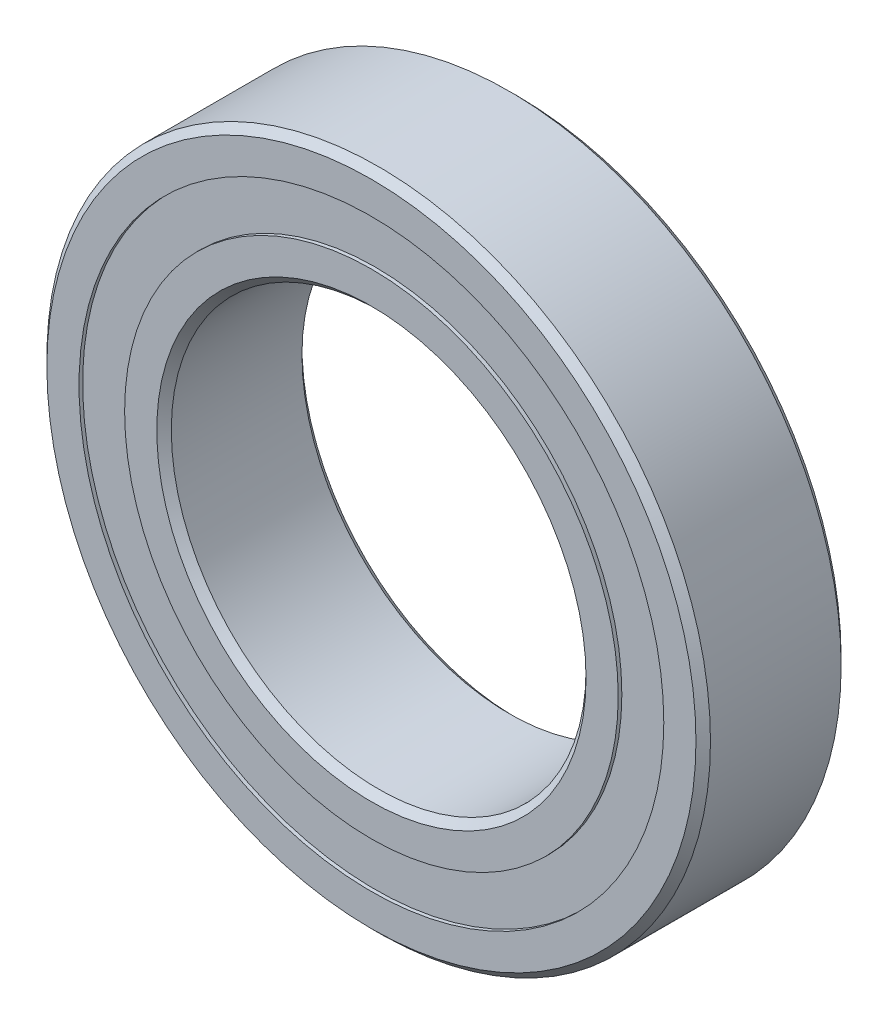
ISO-10303-21;
HEADER;
FILE_DESCRIPTION(('STEP AP214'),'2;1');
FILE_NAME('part.step','',(''),(''),'','','');
FILE_SCHEMA(('AUTOMOTIVE_DESIGN { 1 0 10303 214 1 1 1 1 }'));
ENDSEC;
DATA;
#1=APPLICATION_CONTEXT('core data for automotive mechanical design processes');
#2=APPLICATION_PROTOCOL_DEFINITION('international standard','automotive_design',2000,#1);
#3=PRODUCT_CONTEXT('',#1,'mechanical');
#4=PRODUCT('Part','Part','',(#3));
#5=PRODUCT_RELATED_PRODUCT_CATEGORY('part','',(#4));
#6=PRODUCT_DEFINITION_FORMATION('','',#4);
#7=PRODUCT_DEFINITION_CONTEXT('part definition',#1,'design');
#8=PRODUCT_DEFINITION('design','',#6,#7);
#9=PRODUCT_DEFINITION_SHAPE('','',#8);
#10=(LENGTH_UNIT() NAMED_UNIT(*) SI_UNIT(.MILLI.,.METRE.));
#11=(NAMED_UNIT(*) PLANE_ANGLE_UNIT() SI_UNIT($,.RADIAN.));
#12=(NAMED_UNIT(*) SI_UNIT($,.STERADIAN.) SOLID_ANGLE_UNIT());
#13=UNCERTAINTY_MEASURE_WITH_UNIT(LENGTH_MEASURE(1.E-05),#10,'distance_accuracy_value','');
#14=(GEOMETRIC_REPRESENTATION_CONTEXT(3) GLOBAL_UNCERTAINTY_ASSIGNED_CONTEXT((#13)) GLOBAL_UNIT_ASSIGNED_CONTEXT((#10,
#11,#12)) REPRESENTATION_CONTEXT('',''));
#15=CARTESIAN_POINT('',(0.,0.,0.));
#16=DIRECTION('',(0.,0.,1.));
#17=DIRECTION('',(1.,0.,0.));
#18=AXIS2_PLACEMENT_3D('',#15,#16,#17);
#19=CARTESIAN_POINT('',(13.,0.,0.));
#20=DIRECTION('',(0.,0.,-1.));
#21=DIRECTION('',(1.,0.,0.));
#22=AXIS2_PLACEMENT_3D('',#19,#20,#21);
#23=SPHERICAL_SURFACE('',#22,1.90455682813241);
#24=CARTESIAN_POINT('',(13.,0.,-1.90455682813241));
#25=VERTEX_POINT('',#24);
#26=VERTEX_LOOP('',#25);
#27=FACE_BOUND('',#26,.T.);
#28=ADVANCED_FACE('F44',(#27),#23,.T.);
#29=CLOSED_SHELL('',(#28));
#30=MANIFOLD_SOLID_BREP('B2',#29);
#31=CARTESIAN_POINT('',(0.,14.0989010989011,-3.325));
#32=DIRECTION('',(0.,0.,1.));
#33=DIRECTION('',(-1.,0.,0.));
#34=AXIS2_PLACEMENT_3D('',#31,#32,#33);
#35=PLANE('',#34);
#36=CARTESIAN_POINT('',(0.,0.,-3.325));
#37=DIRECTION('',(0.,0.,1.));
#38=DIRECTION('',(1.,0.,0.));
#39=AXIS2_PLACEMENT_3D('',#36,#37,#38);
#40=CIRCLE('',#39,11.9010989010989);
#41=CARTESIAN_POINT('',(11.9010989010989,0.,-3.325));
#42=VERTEX_POINT('',#41);
#43=EDGE_CURVE('E43',#42,#42,#40,.T.);
#44=ORIENTED_EDGE('',*,*,#43,.T.);
#45=EDGE_LOOP('',(#44));
#46=FACE_BOUND('',#45,.T.);
#47=CARTESIAN_POINT('',(0.,0.,-3.325));
#48=DIRECTION('',(0.,0.,1.));
#49=DIRECTION('',(1.,0.,0.));
#50=AXIS2_PLACEMENT_3D('',#47,#48,#49);
#51=CIRCLE('',#50,14.0989010989011);
#52=CARTESIAN_POINT('',(14.0989010989011,0.,-3.325));
#53=VERTEX_POINT('',#52);
#54=EDGE_CURVE('E79',#53,#53,#51,.T.);
#55=ORIENTED_EDGE('',*,*,#54,.F.);
#56=EDGE_LOOP('',(#55));
#57=FACE_BOUND('',#56,.T.);
#58=ADVANCED_FACE('F65',(#46,#57),#35,.F.);
#59=CARTESIAN_POINT('',(0.,0.,-3.5));
#60=DIRECTION('',(0.,0.,-1.));
#61=DIRECTION('',(1.,0.,0.));
#62=AXIS2_PLACEMENT_3D('',#59,#60,#61);
#63=CYLINDRICAL_SURFACE('',#62,11.9010989010989);
#64=CARTESIAN_POINT('',(0.,0.,-1.90455682813241));
#65=DIRECTION('',(0.,0.,1.));
#66=DIRECTION('',(1.,0.,0.));
#67=AXIS2_PLACEMENT_3D('',#64,#65,#66);
#68=CIRCLE('',#67,11.9010989010989);
#69=CARTESIAN_POINT('',(11.9010989010989,0.,-1.90455682813241));
#70=VERTEX_POINT('',#69);
#71=EDGE_CURVE('E71',#70,#70,#68,.T.);
#72=ORIENTED_EDGE('',*,*,#71,.T.);
#73=EDGE_LOOP('',(#72));
#74=FACE_BOUND('',#73,.T.);
#75=ORIENTED_EDGE('',*,*,#43,.F.);
#76=EDGE_LOOP('',(#75));
#77=FACE_BOUND('',#76,.T.);
#78=ADVANCED_FACE('F89',(#74,#77),#63,.F.);
#79=CARTESIAN_POINT('',(0.,14.0989010989011,-1.90455682813241));
#80=DIRECTION('',(0.,0.,-1.));
#81=DIRECTION('',(1.,0.,0.));
#82=AXIS2_PLACEMENT_3D('',#79,#80,#81);
#83=PLANE('',#82);
#84=CARTESIAN_POINT('',(0.,0.,-1.90455682813241));
#85=DIRECTION('',(0.,0.,1.));
#86=DIRECTION('',(1.,0.,0.));
#87=AXIS2_PLACEMENT_3D('',#84,#85,#86);
#88=CIRCLE('',#87,14.0989010989011);
#89=CARTESIAN_POINT('',(14.0989010989011,0.,-1.90455682813241));
#90=VERTEX_POINT('',#89);
#91=EDGE_CURVE('E75',#90,#90,#88,.T.);
#92=ORIENTED_EDGE('',*,*,#91,.T.);
#93=EDGE_LOOP('',(#92));
#94=FACE_BOUND('',#93,.T.);
#95=ORIENTED_EDGE('',*,*,#71,.F.);
#96=EDGE_LOOP('',(#95));
#97=FACE_BOUND('',#96,.T.);
#98=ADVANCED_FACE('F93',(#94,#97),#83,.F.);
#99=CARTESIAN_POINT('',(0.,0.,-3.5));
#100=DIRECTION('',(0.,0.,-1.));
#101=DIRECTION('',(1.,0.,0.));
#102=AXIS2_PLACEMENT_3D('',#99,#100,#101);
#103=CYLINDRICAL_SURFACE('',#102,14.0989010989011);
#104=ORIENTED_EDGE('',*,*,#54,.T.);
#105=EDGE_LOOP('',(#104));
#106=FACE_BOUND('',#105,.T.);
#107=ORIENTED_EDGE('',*,*,#91,.F.);
#108=EDGE_LOOP('',(#107));
#109=FACE_BOUND('',#108,.T.);
#110=ADVANCED_FACE('F85',(#106,#109),#103,.T.);
#111=CLOSED_SHELL('',(#58,#78,#98,#110));
#112=MANIFOLD_SOLID_BREP('B6',#111);
#113=CARTESIAN_POINT('',(11.2583302491977,6.49999999999997,0.));
#114=DIRECTION('',(0.,0.,-1.));
#115=DIRECTION('',(0.86602540378444,0.499999999999998,0.));
#116=AXIS2_PLACEMENT_3D('',#113,#114,#115);
#117=SPHERICAL_SURFACE('',#116,1.90455682813241);
#118=CARTESIAN_POINT('',(11.2583302491977,6.49999999999997,-1.90455682813241));
#119=VERTEX_POINT('',#118);
#120=VERTEX_LOOP('',#119);
#121=FACE_BOUND('',#120,.T.);
#122=ADVANCED_FACE('F133',(#121),#117,.T.);
#123=CLOSED_SHELL('',(#122));
#124=MANIFOLD_SOLID_BREP('B38',#123);
#125=CARTESIAN_POINT('',(-6.49999999999986,11.2583302491978,0.));
#126=DIRECTION('',(0.,0.,-1.));
#127=DIRECTION('',(-0.499999999999989,0.866025403784445,0.));
#128=AXIS2_PLACEMENT_3D('',#125,#126,#127);
#129=SPHERICAL_SURFACE('',#128,1.90455682813241);
#130=CARTESIAN_POINT('',(-6.49999999999986,11.2583302491978,-1.90455682813241));
#131=VERTEX_POINT('',#130);
#132=VERTEX_LOOP('',#131);
#133=FACE_BOUND('',#132,.T.);
#134=ADVANCED_FACE('F154',(#133),#129,.T.);
#135=CLOSED_SHELL('',(#134));
#136=MANIFOLD_SOLID_BREP('B61',#135);
#137=CARTESIAN_POINT('',(6.50000000000001,11.2583302491977,0.));
#138=DIRECTION('',(0.,0.,-1.));
#139=DIRECTION('',(0.500000000000001,0.866025403784438,0.));
#140=AXIS2_PLACEMENT_3D('',#137,#138,#139);
#141=SPHERICAL_SURFACE('',#140,1.90455682813241);
#142=CARTESIAN_POINT('',(6.50000000000001,11.2583302491977,-1.90455682813241));
#143=VERTEX_POINT('',#142);
#144=VERTEX_LOOP('',#143);
#145=FACE_BOUND('',#144,.T.);
#146=ADVANCED_FACE('F175',(#145),#141,.T.);
#147=CLOSED_SHELL('',(#146));
#148=MANIFOLD_SOLID_BREP('B129',#147);
#149=CARTESIAN_POINT('',(-11.2583302491976,6.50000000000013,0.));
#150=DIRECTION('',(0.,0.,-1.));
#151=DIRECTION('',(-0.866025403784433,0.50000000000001,0.));
#152=AXIS2_PLACEMENT_3D('',#149,#150,#151);
#153=SPHERICAL_SURFACE('',#152,1.90455682813241);
#154=CARTESIAN_POINT('',(-11.2583302491976,6.50000000000013,-1.90455682813241));
#155=VERTEX_POINT('',#154);
#156=VERTEX_LOOP('',#155);
#157=FACE_BOUND('',#156,.T.);
#158=ADVANCED_FACE('F196',(#157),#153,.T.);
#159=CLOSED_SHELL('',(#158));
#160=MANIFOLD_SOLID_BREP('B150',#159);
#161=CARTESIAN_POINT('',(0.,13.,0.));
#162=DIRECTION('',(0.,0.,-1.));
#163=DIRECTION('',(0.,1.,0.));
#164=AXIS2_PLACEMENT_3D('',#161,#162,#163);
#165=SPHERICAL_SURFACE('',#164,1.90455682813241);
#166=CARTESIAN_POINT('',(0.,13.,-1.90455682813241));
#167=VERTEX_POINT('',#166);
#168=VERTEX_LOOP('',#167);
#169=FACE_BOUND('',#168,.T.);
#170=ADVANCED_FACE('F217',(#169),#165,.T.);
#171=CLOSED_SHELL('',(#170));
#172=MANIFOLD_SOLID_BREP('B171',#171);
#173=CARTESIAN_POINT('',(-13.,1.36167772214882E-13,0.));
#174=DIRECTION('',(0.,0.,-1.));
#175=DIRECTION('',(-1.,0.,0.));
#176=AXIS2_PLACEMENT_3D('',#173,#174,#175);
#177=SPHERICAL_SURFACE('',#176,1.90455682813241);
#178=CARTESIAN_POINT('',(-13.,1.36167772214882E-13,-1.90455682813241));
#179=VERTEX_POINT('',#178);
#180=VERTEX_LOOP('',#179);
#181=FACE_BOUND('',#180,.T.);
#182=ADVANCED_FACE('F236',(#181),#177,.T.);
#183=CLOSED_SHELL('',(#182));
#184=MANIFOLD_SOLID_BREP('B192',#183);
#185=CARTESIAN_POINT('',(-11.2583302491978,-6.4999999999999,0.));
#186=DIRECTION('',(0.,0.,-1.));
#187=DIRECTION('',(-0.866025403784443,-0.499999999999992,0.));
#188=AXIS2_PLACEMENT_3D('',#185,#186,#187);
#189=SPHERICAL_SURFACE('',#188,1.90455682813241);
#190=CARTESIAN_POINT('',(-11.2583302491978,-6.4999999999999,-1.90455682813241));
#191=VERTEX_POINT('',#190);
#192=VERTEX_LOOP('',#191);
#193=FACE_BOUND('',#192,.T.);
#194=ADVANCED_FACE('F259',(#193),#189,.T.);
#195=CLOSED_SHELL('',(#194));
#196=MANIFOLD_SOLID_BREP('B213',#195);
#197=CARTESIAN_POINT('',(0.,0.,-3.15));
#198=DIRECTION('',(0.,0.,1.));
#199=DIRECTION('',(-1.,0.,0.));
#200=AXIS2_PLACEMENT_3D('',#197,#198,#199);
#201=CONICAL_SURFACE('',#200,16.,0.785398163397448);
#202=CARTESIAN_POINT('',(0.,0.,-3.5));
#203=DIRECTION('',(0.,0.,1.));
#204=DIRECTION('',(1.,0.,0.));
#205=AXIS2_PLACEMENT_3D('',#202,#203,#204);
#206=CIRCLE('',#205,15.65);
#207=CARTESIAN_POINT('',(15.65,0.,-3.5));
#208=VERTEX_POINT('',#207);
#209=EDGE_CURVE('E308',#208,#208,#206,.T.);
#210=ORIENTED_EDGE('',*,*,#209,.T.);
#211=EDGE_LOOP('',(#210));
#212=FACE_BOUND('',#211,.T.);
#213=CARTESIAN_POINT('',(0.,0.,-3.15));
#214=DIRECTION('',(0.,0.,1.));
#215=DIRECTION('',(1.,0.,0.));
#216=AXIS2_PLACEMENT_3D('',#213,#214,#215);
#217=CIRCLE('',#216,16.);
#218=CARTESIAN_POINT('',(16.,0.,-3.15));
#219=VERTEX_POINT('',#218);
#220=EDGE_CURVE('E258',#219,#219,#217,.T.);
#221=ORIENTED_EDGE('',*,*,#220,.F.);
#222=EDGE_LOOP('',(#221));
#223=FACE_BOUND('',#222,.T.);
#224=ADVANCED_FACE('F280',(#212,#223),#201,.T.);
#225=CARTESIAN_POINT('',(0.,0.,-3.5));
#226=DIRECTION('',(0.,0.,-1.));
#227=DIRECTION('',(1.,0.,0.));
#228=AXIS2_PLACEMENT_3D('',#225,#226,#227);
#229=CYLINDRICAL_SURFACE('',#228,16.);
#230=ORIENTED_EDGE('',*,*,#220,.T.);
#231=EDGE_LOOP('',(#230));
#232=FACE_BOUND('',#231,.T.);
#233=CARTESIAN_POINT('',(0.,0.,3.15));
#234=DIRECTION('',(0.,0.,1.));
#235=DIRECTION('',(1.,0.,0.));
#236=AXIS2_PLACEMENT_3D('',#233,#234,#235);
#237=CIRCLE('',#236,16.);
#238=CARTESIAN_POINT('',(16.,0.,3.15));
#239=VERTEX_POINT('',#238);
#240=EDGE_CURVE('E286',#239,#239,#237,.T.);
#241=ORIENTED_EDGE('',*,*,#240,.F.);
#242=EDGE_LOOP('',(#241));
#243=FACE_BOUND('',#242,.T.);
#244=ADVANCED_FACE('F326',(#232,#243),#229,.T.);
#245=CARTESIAN_POINT('',(0.,0.,3.5));
#246=DIRECTION('',(0.,0.,-1.));
#247=DIRECTION('',(1.,0.,0.));
#248=AXIS2_PLACEMENT_3D('',#245,#246,#247);
#249=CONICAL_SURFACE('',#248,15.65,0.785398163397446);
#250=ORIENTED_EDGE('',*,*,#240,.T.);
#251=EDGE_LOOP('',(#250));
#252=FACE_BOUND('',#251,.T.);
#253=CARTESIAN_POINT('',(0.,0.,3.5));
#254=DIRECTION('',(0.,0.,1.));
#255=DIRECTION('',(1.,0.,0.));
#256=AXIS2_PLACEMENT_3D('',#253,#254,#255);
#257=CIRCLE('',#256,15.65);
#258=CARTESIAN_POINT('',(15.65,0.,3.5));
#259=VERTEX_POINT('',#258);
#260=EDGE_CURVE('E290',#259,#259,#257,.T.);
#261=ORIENTED_EDGE('',*,*,#260,.F.);
#262=EDGE_LOOP('',(#261));
#263=FACE_BOUND('',#262,.T.);
#264=ADVANCED_FACE('F330',(#252,#263),#249,.T.);
#265=CARTESIAN_POINT('',(0.,15.65,3.5));
#266=DIRECTION('',(0.,0.,-1.));
#267=DIRECTION('',(1.,0.,0.));
#268=AXIS2_PLACEMENT_3D('',#265,#266,#267);
#269=PLANE('',#268);
#270=ORIENTED_EDGE('',*,*,#260,.T.);
#271=EDGE_LOOP('',(#270));
#272=FACE_BOUND('',#271,.T.);
#273=CARTESIAN_POINT('',(0.,0.,3.5));
#274=DIRECTION('',(0.,0.,1.));
#275=DIRECTION('',(1.,0.,0.));
#276=AXIS2_PLACEMENT_3D('',#273,#274,#275);
#277=CIRCLE('',#276,14.0989010989011);
#278=CARTESIAN_POINT('',(14.0989010989011,0.,3.5));
#279=VERTEX_POINT('',#278);
#280=EDGE_CURVE('E294',#279,#279,#277,.T.);
#281=ORIENTED_EDGE('',*,*,#280,.F.);
#282=EDGE_LOOP('',(#281));
#283=FACE_BOUND('',#282,.T.);
#284=ADVANCED_FACE('F334',(#272,#283),#269,.F.);
#285=CARTESIAN_POINT('',(0.,0.,-3.5));
#286=DIRECTION('',(0.,0.,-1.));
#287=DIRECTION('',(1.,0.,0.));
#288=AXIS2_PLACEMENT_3D('',#285,#286,#287);
#289=CYLINDRICAL_SURFACE('',#288,14.0989010989011);
#290=ORIENTED_EDGE('',*,*,#280,.T.);
#291=EDGE_LOOP('',(#290));
#292=FACE_BOUND('',#291,.T.);
#293=CARTESIAN_POINT('',(0.,0.,1.55555555555556));
#294=DIRECTION('',(0.,0.,1.));
#295=DIRECTION('',(1.,0.,0.));
#296=AXIS2_PLACEMENT_3D('',#293,#294,#295);
#297=CIRCLE('',#296,14.0989010989011);
#298=CARTESIAN_POINT('',(14.0989010989011,0.,1.55555555555556));
#299=VERTEX_POINT('',#298);
#300=EDGE_CURVE('E299',#299,#299,#297,.T.);
#301=ORIENTED_EDGE('',*,*,#300,.F.);
#302=EDGE_LOOP('',(#301));
#303=FACE_BOUND('',#302,.T.);
#304=ADVANCED_FACE('F340',(#292,#303),#289,.F.);
#305=CARTESIAN_POINT('',(0.,0.,0.));
#306=DIRECTION('',(0.,0.,-1.));
#307=DIRECTION('',(1.,0.,0.));
#308=AXIS2_PLACEMENT_3D('',#305,#306,#307);
#309=TOROIDAL_SURFACE('',#308,13.,1.90455682813241);
#310=ORIENTED_EDGE('',*,*,#300,.T.);
#311=EDGE_LOOP('',(#310));
#312=FACE_BOUND('',#311,.T.);
#313=CARTESIAN_POINT('',(0.,0.,-1.55555555555555));
#314=DIRECTION('',(0.,0.,1.));
#315=DIRECTION('',(1.,0.,0.));
#316=AXIS2_PLACEMENT_3D('',#313,#314,#315);
#317=CIRCLE('',#316,14.0989010989011);
#318=CARTESIAN_POINT('',(14.0989010989011,0.,-1.55555555555555));
#319=VERTEX_POINT('',#318);
#320=EDGE_CURVE('E302',#319,#319,#317,.T.);
#321=ORIENTED_EDGE('',*,*,#320,.F.);
#322=EDGE_LOOP('',(#321));
#323=FACE_BOUND('',#322,.T.);
#324=ADVANCED_FACE('F322',(#312,#323),#309,.F.);
#325=CARTESIAN_POINT('',(0.,0.,-3.5));
#326=DIRECTION('',(0.,0.,-1.));
#327=DIRECTION('',(1.,0.,0.));
#328=AXIS2_PLACEMENT_3D('',#325,#326,#327);
#329=CYLINDRICAL_SURFACE('',#328,14.0989010989011);
#330=ORIENTED_EDGE('',*,*,#320,.T.);
#331=EDGE_LOOP('',(#330));
#332=FACE_BOUND('',#331,.T.);
#333=CARTESIAN_POINT('',(0.,0.,-3.5));
#334=DIRECTION('',(0.,0.,1.));
#335=DIRECTION('',(1.,0.,0.));
#336=AXIS2_PLACEMENT_3D('',#333,#334,#335);
#337=CIRCLE('',#336,14.0989010989011);
#338=CARTESIAN_POINT('',(14.0989010989011,0.,-3.5));
#339=VERTEX_POINT('',#338);
#340=EDGE_CURVE('E305',#339,#339,#337,.T.);
#341=ORIENTED_EDGE('',*,*,#340,.F.);
#342=EDGE_LOOP('',(#341));
#343=FACE_BOUND('',#342,.T.);
#344=ADVANCED_FACE('F316',(#332,#343),#329,.F.);
#345=CARTESIAN_POINT('',(0.,15.65,-3.5));
#346=DIRECTION('',(0.,0.,1.));
#347=DIRECTION('',(-1.,0.,0.));
#348=AXIS2_PLACEMENT_3D('',#345,#346,#347);
#349=PLANE('',#348);
#350=ORIENTED_EDGE('',*,*,#340,.T.);
#351=EDGE_LOOP('',(#350));
#352=FACE_BOUND('',#351,.T.);
#353=ORIENTED_EDGE('',*,*,#209,.F.);
#354=EDGE_LOOP('',(#353));
#355=FACE_BOUND('',#354,.T.);
#356=ADVANCED_FACE('F314',(#352,#355),#349,.F.);
#357=CLOSED_SHELL('',(#224,#244,#264,#284,#304,#324,#344,#356));
#358=MANIFOLD_SOLID_BREP('B232',#357);
#359=CARTESIAN_POINT('',(-6.50000000000009,-11.2583302491977,0.));
#360=DIRECTION('',(0.,0.,-1.));
#361=DIRECTION('',(-0.500000000000007,-0.866025403784435,0.));
#362=AXIS2_PLACEMENT_3D('',#359,#360,#361);
#363=SPHERICAL_SURFACE('',#362,1.90455682813241);
#364=CARTESIAN_POINT('',(-6.50000000000009,-11.2583302491977,-1.90455682813241));
#365=VERTEX_POINT('',#364);
#366=VERTEX_LOOP('',#365);
#367=FACE_BOUND('',#366,.T.);
#368=ADVANCED_FACE('F410',(#367),#363,.T.);
#369=CLOSED_SHELL('',(#368));
#370=MANIFOLD_SOLID_BREP('B253',#369);
#371=CARTESIAN_POINT('',(0.,14.0989010989011,3.325));
#372=DIRECTION('',(0.,0.,-1.));
#373=DIRECTION('',(1.,0.,0.));
#374=AXIS2_PLACEMENT_3D('',#371,#372,#373);
#375=PLANE('',#374);
#376=CARTESIAN_POINT('',(0.,0.,3.325));
#377=DIRECTION('',(0.,0.,1.));
#378=DIRECTION('',(1.,0.,0.));
#379=AXIS2_PLACEMENT_3D('',#376,#377,#378);
#380=CIRCLE('',#379,14.0989010989011);
#381=CARTESIAN_POINT('',(14.0989010989011,0.,3.325));
#382=VERTEX_POINT('',#381);
#383=EDGE_CURVE('E445',#382,#382,#380,.T.);
#384=ORIENTED_EDGE('',*,*,#383,.T.);
#385=EDGE_LOOP('',(#384));
#386=FACE_BOUND('',#385,.T.);
#387=CARTESIAN_POINT('',(0.,0.,3.325));
#388=DIRECTION('',(0.,0.,1.));
#389=DIRECTION('',(1.,0.,0.));
#390=AXIS2_PLACEMENT_3D('',#387,#388,#389);
#391=CIRCLE('',#390,11.9010989010989);
#392=CARTESIAN_POINT('',(11.9010989010989,0.,3.325));
#393=VERTEX_POINT('',#392);
#394=EDGE_CURVE('E409',#393,#393,#391,.T.);
#395=ORIENTED_EDGE('',*,*,#394,.F.);
#396=EDGE_LOOP('',(#395));
#397=FACE_BOUND('',#396,.T.);
#398=ADVANCED_FACE('F431',(#386,#397),#375,.F.);
#399=CARTESIAN_POINT('',(0.,0.,-3.5));
#400=DIRECTION('',(0.,0.,-1.));
#401=DIRECTION('',(1.,0.,0.));
#402=AXIS2_PLACEMENT_3D('',#399,#400,#401);
#403=CYLINDRICAL_SURFACE('',#402,11.9010989010989);
#404=ORIENTED_EDGE('',*,*,#394,.T.);
#405=EDGE_LOOP('',(#404));
#406=FACE_BOUND('',#405,.T.);
#407=CARTESIAN_POINT('',(0.,0.,1.90455682813241));
#408=DIRECTION('',(0.,0.,1.));
#409=DIRECTION('',(1.,0.,0.));
#410=AXIS2_PLACEMENT_3D('',#407,#408,#409);
#411=CIRCLE('',#410,11.9010989010989);
#412=CARTESIAN_POINT('',(11.9010989010989,0.,1.90455682813241));
#413=VERTEX_POINT('',#412);
#414=EDGE_CURVE('E437',#413,#413,#411,.T.);
#415=ORIENTED_EDGE('',*,*,#414,.F.);
#416=EDGE_LOOP('',(#415));
#417=FACE_BOUND('',#416,.T.);
#418=ADVANCED_FACE('F461',(#406,#417),#403,.F.);
#419=CARTESIAN_POINT('',(0.,14.0989010989011,1.90455682813241));
#420=DIRECTION('',(0.,0.,1.));
#421=DIRECTION('',(-1.,0.,0.));
#422=AXIS2_PLACEMENT_3D('',#419,#420,#421);
#423=PLANE('',#422);
#424=ORIENTED_EDGE('',*,*,#414,.T.);
#425=EDGE_LOOP('',(#424));
#426=FACE_BOUND('',#425,.T.);
#427=CARTESIAN_POINT('',(0.,0.,1.90455682813241));
#428=DIRECTION('',(0.,0.,1.));
#429=DIRECTION('',(1.,0.,0.));
#430=AXIS2_PLACEMENT_3D('',#427,#428,#429);
#431=CIRCLE('',#430,14.0989010989011);
#432=CARTESIAN_POINT('',(14.0989010989011,0.,1.90455682813241));
#433=VERTEX_POINT('',#432);
#434=EDGE_CURVE('E441',#433,#433,#431,.T.);
#435=ORIENTED_EDGE('',*,*,#434,.F.);
#436=EDGE_LOOP('',(#435));
#437=FACE_BOUND('',#436,.T.);
#438=ADVANCED_FACE('F455',(#426,#437),#423,.F.);
#439=CARTESIAN_POINT('',(0.,0.,-3.5));
#440=DIRECTION('',(0.,0.,-1.));
#441=DIRECTION('',(1.,0.,0.));
#442=AXIS2_PLACEMENT_3D('',#439,#440,#441);
#443=CYLINDRICAL_SURFACE('',#442,14.0989010989011);
#444=ORIENTED_EDGE('',*,*,#434,.T.);
#445=EDGE_LOOP('',(#444));
#446=FACE_BOUND('',#445,.T.);
#447=ORIENTED_EDGE('',*,*,#383,.F.);
#448=EDGE_LOOP('',(#447));
#449=FACE_BOUND('',#448,.T.);
#450=ADVANCED_FACE('F453',(#446,#449),#443,.T.);
#451=CLOSED_SHELL('',(#398,#418,#438,#450));
#452=MANIFOLD_SOLID_BREP('B276',#451);
#453=CARTESIAN_POINT('',(0.,-13.,0.));
#454=DIRECTION('',(0.,0.,-1.));
#455=DIRECTION('',(0.,-1.,0.));
#456=AXIS2_PLACEMENT_3D('',#453,#454,#455);
#457=SPHERICAL_SURFACE('',#456,1.90455682813241);
#458=CARTESIAN_POINT('',(0.,-13.,-1.90455682813241));
#459=VERTEX_POINT('',#458);
#460=VERTEX_LOOP('',#459);
#461=FACE_BOUND('',#460,.T.);
#462=ADVANCED_FACE('F499',(#461),#457,.T.);
#463=CLOSED_SHELL('',(#462));
#464=MANIFOLD_SOLID_BREP('B404',#463);
#465=CARTESIAN_POINT('',(6.49999999999993,-11.2583302491977,0.));
#466=DIRECTION('',(0.,0.,-1.));
#467=DIRECTION('',(0.499999999999995,-0.866025403784442,0.));
#468=AXIS2_PLACEMENT_3D('',#465,#466,#467);
#469=SPHERICAL_SURFACE('',#468,1.90455682813241);
#470=CARTESIAN_POINT('',(6.49999999999993,-11.2583302491977,-1.90455682813241));
#471=VERTEX_POINT('',#470);
#472=VERTEX_LOOP('',#471);
#473=FACE_BOUND('',#472,.T.);
#474=ADVANCED_FACE('F520',(#473),#469,.T.);
#475=CLOSED_SHELL('',(#474));
#476=MANIFOLD_SOLID_BREP('B427',#475);
#477=CARTESIAN_POINT('',(11.2583302491977,-6.50000000000005,0.));
#478=DIRECTION('',(0.,0.,-1.));
#479=DIRECTION('',(0.866025403784436,-0.500000000000004,0.));
#480=AXIS2_PLACEMENT_3D('',#477,#478,#479);
#481=SPHERICAL_SURFACE('',#480,1.90455682813241);
#482=CARTESIAN_POINT('',(11.2583302491977,-6.50000000000005,-1.90455682813241));
#483=VERTEX_POINT('',#482);
#484=VERTEX_LOOP('',#483);
#485=FACE_BOUND('',#484,.T.);
#486=ADVANCED_FACE('F542',(#485),#481,.T.);
#487=CLOSED_SHELL('',(#486));
#488=MANIFOLD_SOLID_BREP('B495',#487);
#489=CARTESIAN_POINT('',(0.,11.9010989010989,-3.5));
#490=DIRECTION('',(0.,0.,1.));
#491=DIRECTION('',(-1.,0.,0.));
#492=AXIS2_PLACEMENT_3D('',#489,#490,#491);
#493=PLANE('',#492);
#494=CARTESIAN_POINT('',(0.,0.,-3.5));
#495=DIRECTION('',(0.,0.,1.));
#496=DIRECTION('',(1.,0.,0.));
#497=AXIS2_PLACEMENT_3D('',#494,#495,#496);
#498=CIRCLE('',#497,10.35);
#499=CARTESIAN_POINT('',(10.35,0.,-3.5));
#500=VERTEX_POINT('',#499);
#501=EDGE_CURVE('E585',#500,#500,#498,.T.);
#502=ORIENTED_EDGE('',*,*,#501,.T.);
#503=EDGE_LOOP('',(#502));
#504=FACE_BOUND('',#503,.T.);
#505=CARTESIAN_POINT('',(0.,0.,-3.5));
#506=DIRECTION('',(0.,0.,1.));
#507=DIRECTION('',(1.,0.,0.));
#508=AXIS2_PLACEMENT_3D('',#505,#506,#507);
#509=CIRCLE('',#508,11.9010989010989);
#510=CARTESIAN_POINT('',(11.9010989010989,0.,-3.5));
#511=VERTEX_POINT('',#510);
#512=EDGE_CURVE('E541',#511,#511,#509,.T.);
#513=ORIENTED_EDGE('',*,*,#512,.F.);
#514=EDGE_LOOP('',(#513));
#515=FACE_BOUND('',#514,.T.);
#516=ADVANCED_FACE('F557',(#504,#515),#493,.F.);
#517=CARTESIAN_POINT('',(0.,0.,-3.5));
#518=DIRECTION('',(0.,0.,-1.));
#519=DIRECTION('',(1.,0.,0.));
#520=AXIS2_PLACEMENT_3D('',#517,#518,#519);
#521=CYLINDRICAL_SURFACE('',#520,11.9010989010989);
#522=ORIENTED_EDGE('',*,*,#512,.T.);
#523=EDGE_LOOP('',(#522));
#524=FACE_BOUND('',#523,.T.);
#525=CARTESIAN_POINT('',(0.,0.,-1.55555555555555));
#526=DIRECTION('',(0.,0.,1.));
#527=DIRECTION('',(1.,0.,0.));
#528=AXIS2_PLACEMENT_3D('',#525,#526,#527);
#529=CIRCLE('',#528,11.9010989010989);
#530=CARTESIAN_POINT('',(11.9010989010989,0.,-1.55555555555555));
#531=VERTEX_POINT('',#530);
#532=EDGE_CURVE('E563',#531,#531,#529,.T.);
#533=ORIENTED_EDGE('',*,*,#532,.F.);
#534=EDGE_LOOP('',(#533));
#535=FACE_BOUND('',#534,.T.);
#536=ADVANCED_FACE('F603',(#524,#535),#521,.T.);
#537=CARTESIAN_POINT('',(0.,0.,0.));
#538=DIRECTION('',(0.,0.,-1.));
#539=DIRECTION('',(1.,0.,0.));
#540=AXIS2_PLACEMENT_3D('',#537,#538,#539);
#541=TOROIDAL_SURFACE('',#540,13.,1.90455682813241);
#542=ORIENTED_EDGE('',*,*,#532,.T.);
#543=EDGE_LOOP('',(#542));
#544=FACE_BOUND('',#543,.T.);
#545=CARTESIAN_POINT('',(0.,0.,1.55555555555556));
#546=DIRECTION('',(0.,0.,1.));
#547=DIRECTION('',(1.,0.,0.));
#548=AXIS2_PLACEMENT_3D('',#545,#546,#547);
#549=CIRCLE('',#548,11.9010989010989);
#550=CARTESIAN_POINT('',(11.9010989010989,0.,1.55555555555556));
#551=VERTEX_POINT('',#550);
#552=EDGE_CURVE('E567',#551,#551,#549,.T.);
#553=ORIENTED_EDGE('',*,*,#552,.F.);
#554=EDGE_LOOP('',(#553));
#555=FACE_BOUND('',#554,.T.);
#556=ADVANCED_FACE('F607',(#544,#555),#541,.F.);
#557=CARTESIAN_POINT('',(0.,0.,-3.5));
#558=DIRECTION('',(0.,0.,-1.));
#559=DIRECTION('',(1.,0.,0.));
#560=AXIS2_PLACEMENT_3D('',#557,#558,#559);
#561=CYLINDRICAL_SURFACE('',#560,11.9010989010989);
#562=ORIENTED_EDGE('',*,*,#552,.T.);
#563=EDGE_LOOP('',(#562));
#564=FACE_BOUND('',#563,.T.);
#565=CARTESIAN_POINT('',(0.,0.,3.5));
#566=DIRECTION('',(0.,0.,1.));
#567=DIRECTION('',(1.,0.,0.));
#568=AXIS2_PLACEMENT_3D('',#565,#566,#567);
#569=CIRCLE('',#568,11.9010989010989);
#570=CARTESIAN_POINT('',(11.9010989010989,0.,3.5));
#571=VERTEX_POINT('',#570);
#572=EDGE_CURVE('E571',#571,#571,#569,.T.);
#573=ORIENTED_EDGE('',*,*,#572,.F.);
#574=EDGE_LOOP('',(#573));
#575=FACE_BOUND('',#574,.T.);
#576=ADVANCED_FACE('F611',(#564,#575),#561,.T.);
#577=CARTESIAN_POINT('',(0.,10.35,3.5));
#578=DIRECTION('',(0.,0.,-1.));
#579=DIRECTION('',(1.,0.,0.));
#580=AXIS2_PLACEMENT_3D('',#577,#578,#579);
#581=PLANE('',#580);
#582=ORIENTED_EDGE('',*,*,#572,.T.);
#583=EDGE_LOOP('',(#582));
#584=FACE_BOUND('',#583,.T.);
#585=CARTESIAN_POINT('',(0.,0.,3.5));
#586=DIRECTION('',(0.,0.,1.));
#587=DIRECTION('',(1.,0.,0.));
#588=AXIS2_PLACEMENT_3D('',#585,#586,#587);
#589=CIRCLE('',#588,10.35);
#590=CARTESIAN_POINT('',(10.35,0.,3.5));
#591=VERTEX_POINT('',#590);
#592=EDGE_CURVE('E576',#591,#591,#589,.T.);
#593=ORIENTED_EDGE('',*,*,#592,.F.);
#594=EDGE_LOOP('',(#593));
#595=FACE_BOUND('',#594,.T.);
#596=ADVANCED_FACE('F617',(#584,#595),#581,.F.);
#597=CARTESIAN_POINT('',(0.,0.,3.15));
#598=DIRECTION('',(0.,0.,1.));
#599=DIRECTION('',(-1.,0.,0.));
#600=AXIS2_PLACEMENT_3D('',#597,#598,#599);
#601=CONICAL_SURFACE('',#600,10.,0.785398163397446);
#602=ORIENTED_EDGE('',*,*,#592,.T.);
#603=EDGE_LOOP('',(#602));
#604=FACE_BOUND('',#603,.T.);
#605=CARTESIAN_POINT('',(0.,0.,3.15));
#606=DIRECTION('',(0.,0.,1.));
#607=DIRECTION('',(1.,0.,0.));
#608=AXIS2_PLACEMENT_3D('',#605,#606,#607);
#609=CIRCLE('',#608,10.);
#610=CARTESIAN_POINT('',(10.,0.,3.15));
#611=VERTEX_POINT('',#610);
#612=EDGE_CURVE('E579',#611,#611,#609,.T.);
#613=ORIENTED_EDGE('',*,*,#612,.F.);
#614=EDGE_LOOP('',(#613));
#615=FACE_BOUND('',#614,.T.);
#616=ADVANCED_FACE('F599',(#604,#615),#601,.F.);
#617=CARTESIAN_POINT('',(0.,0.,-3.5));
#618=DIRECTION('',(0.,0.,-1.));
#619=DIRECTION('',(1.,0.,0.));
#620=AXIS2_PLACEMENT_3D('',#617,#618,#619);
#621=CYLINDRICAL_SURFACE('',#620,10.);
#622=ORIENTED_EDGE('',*,*,#612,.T.);
#623=EDGE_LOOP('',(#622));
#624=FACE_BOUND('',#623,.T.);
#625=CARTESIAN_POINT('',(0.,0.,-3.15));
#626=DIRECTION('',(0.,0.,1.));
#627=DIRECTION('',(1.,0.,0.));
#628=AXIS2_PLACEMENT_3D('',#625,#626,#627);
#629=CIRCLE('',#628,10.);
#630=CARTESIAN_POINT('',(10.,0.,-3.15));
#631=VERTEX_POINT('',#630);
#632=EDGE_CURVE('E582',#631,#631,#629,.T.);
#633=ORIENTED_EDGE('',*,*,#632,.F.);
#634=EDGE_LOOP('',(#633));
#635=FACE_BOUND('',#634,.T.);
#636=ADVANCED_FACE('F593',(#624,#635),#621,.F.);
#637=CARTESIAN_POINT('',(0.,0.,-3.5));
#638=DIRECTION('',(0.,0.,-1.));
#639=DIRECTION('',(1.,0.,0.));
#640=AXIS2_PLACEMENT_3D('',#637,#638,#639);
#641=CONICAL_SURFACE('',#640,10.35,0.785398163397453);
#642=ORIENTED_EDGE('',*,*,#632,.T.);
#643=EDGE_LOOP('',(#642));
#644=FACE_BOUND('',#643,.T.);
#645=ORIENTED_EDGE('',*,*,#501,.F.);
#646=EDGE_LOOP('',(#645));
#647=FACE_BOUND('',#646,.T.);
#648=ADVANCED_FACE('F591',(#644,#647),#641,.F.);
#649=CLOSED_SHELL('',(#516,#536,#556,#576,#596,#616,#636,#648));
#650=MANIFOLD_SOLID_BREP('B516',#649);
#651=ADVANCED_BREP_SHAPE_REPRESENTATION('',(#18,#30,#112,#124,#136,#148,#160,#172,#184,#196,
#358,#370,#452,#464,#476,#488,#650),#14);
#652=SHAPE_DEFINITION_REPRESENTATION(#9,#651);
ENDSEC;
END-ISO-10303-21;
